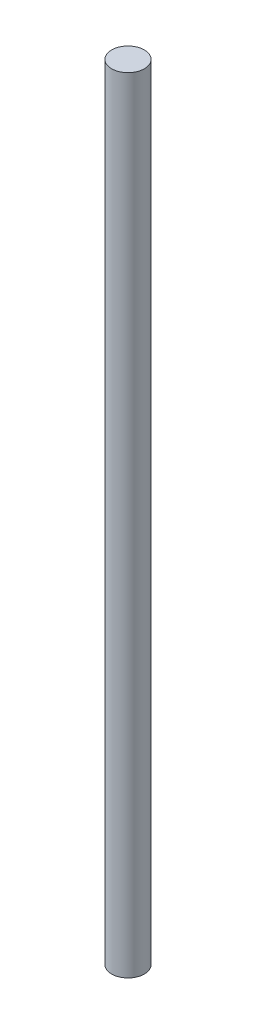
ISO-10303-21;
HEADER;
FILE_DESCRIPTION(('STEP AP214'),'2;1');
FILE_NAME('part.step','',(''),(''),'','','');
FILE_SCHEMA(('AUTOMOTIVE_DESIGN { 1 0 10303 214 1 1 1 1 }'));
ENDSEC;
DATA;
#1=APPLICATION_CONTEXT('core data for automotive mechanical design processes');
#2=APPLICATION_PROTOCOL_DEFINITION('international standard','automotive_design',2000,#1);
#3=PRODUCT_CONTEXT('',#1,'mechanical');
#4=PRODUCT('Part','Part','',(#3));
#5=PRODUCT_RELATED_PRODUCT_CATEGORY('part','',(#4));
#6=PRODUCT_DEFINITION_FORMATION('','',#4);
#7=PRODUCT_DEFINITION_CONTEXT('part definition',#1,'design');
#8=PRODUCT_DEFINITION('design','',#6,#7);
#9=PRODUCT_DEFINITION_SHAPE('','',#8);
#10=(LENGTH_UNIT() NAMED_UNIT(*) SI_UNIT(.MILLI.,.METRE.));
#11=(NAMED_UNIT(*) PLANE_ANGLE_UNIT() SI_UNIT($,.RADIAN.));
#12=(NAMED_UNIT(*) SI_UNIT($,.STERADIAN.) SOLID_ANGLE_UNIT());
#13=UNCERTAINTY_MEASURE_WITH_UNIT(LENGTH_MEASURE(1.E-05),#10,'distance_accuracy_value','');
#14=(GEOMETRIC_REPRESENTATION_CONTEXT(3) GLOBAL_UNCERTAINTY_ASSIGNED_CONTEXT((#13)) GLOBAL_UNIT_ASSIGNED_CONTEXT((#10,
#11,#12)) REPRESENTATION_CONTEXT('',''));
#15=CARTESIAN_POINT('',(0.,0.,0.));
#16=DIRECTION('',(0.,0.,1.));
#17=DIRECTION('',(1.,0.,0.));
#18=AXIS2_PLACEMENT_3D('',#15,#16,#17);
#19=CARTESIAN_POINT('',(0.,1219.2,0.));
#20=DIRECTION('',(0.,-1.,0.));
#21=DIRECTION('',(0.,0.,-1.));
#22=AXIS2_PLACEMENT_3D('',#19,#20,#21);
#23=CYLINDRICAL_SURFACE('',#22,25.4);
#24=CARTESIAN_POINT('',(0.,1219.2,0.));
#25=DIRECTION('',(0.,1.,0.));
#26=DIRECTION('',(0.,0.,1.));
#27=AXIS2_PLACEMENT_3D('',#24,#25,#26);
#28=CIRCLE('',#27,25.4);
#29=CARTESIAN_POINT('',(0.,1219.2,-25.4));
#30=VERTEX_POINT('',#29);
#31=EDGE_CURVE('E10',#30,#30,#28,.T.);
#32=CARTESIAN_POINT('',(0.,0.,0.));
#33=DIRECTION('',(0.,1.,0.));
#34=DIRECTION('',(0.,0.,1.));
#35=AXIS2_PLACEMENT_3D('',#32,#33,#34);
#36=CIRCLE('',#35,25.4);
#37=CARTESIAN_POINT('',(0.,0.,-25.4));
#38=VERTEX_POINT('',#37);
#39=EDGE_CURVE('E33',#38,#38,#36,.T.);
#40=CARTESIAN_POINT('',(0.,1219.2,-25.4));
#41=CARTESIAN_POINT('',(0.,1206.5,-25.4));
#42=CARTESIAN_POINT('',(0.,1193.8,-25.4));
#43=CARTESIAN_POINT('',(0.,1168.4,-25.4));
#44=CARTESIAN_POINT('',(0.,1155.7,-25.4));
#45=CARTESIAN_POINT('',(0.,1130.3,-25.4));
#46=CARTESIAN_POINT('',(0.,1117.6,-25.4));
#47=CARTESIAN_POINT('',(0.,1092.2,-25.4));
#48=CARTESIAN_POINT('',(0.,1079.5,-25.4));
#49=CARTESIAN_POINT('',(0.,1054.1,-25.4));
#50=CARTESIAN_POINT('',(0.,1041.4,-25.4));
#51=CARTESIAN_POINT('',(0.,1016.,-25.4));
#52=CARTESIAN_POINT('',(0.,1003.3,-25.4));
#53=CARTESIAN_POINT('',(0.,977.9,-25.4));
#54=CARTESIAN_POINT('',(0.,965.2,-25.4));
#55=CARTESIAN_POINT('',(0.,939.8,-25.4));
#56=CARTESIAN_POINT('',(0.,927.1,-25.4));
#57=CARTESIAN_POINT('',(0.,901.7,-25.4));
#58=CARTESIAN_POINT('',(0.,889.,-25.4));
#59=CARTESIAN_POINT('',(0.,863.6,-25.4));
#60=CARTESIAN_POINT('',(0.,850.9,-25.4));
#61=CARTESIAN_POINT('',(0.,825.5,-25.4));
#62=CARTESIAN_POINT('',(0.,812.8,-25.4));
#63=CARTESIAN_POINT('',(0.,787.4,-25.4));
#64=CARTESIAN_POINT('',(0.,774.7,-25.4));
#65=CARTESIAN_POINT('',(0.,749.3,-25.4));
#66=CARTESIAN_POINT('',(0.,736.6,-25.4));
#67=CARTESIAN_POINT('',(0.,711.2,-25.4));
#68=CARTESIAN_POINT('',(0.,698.5,-25.4));
#69=CARTESIAN_POINT('',(0.,673.1,-25.4));
#70=CARTESIAN_POINT('',(0.,660.4,-25.4));
#71=CARTESIAN_POINT('',(0.,635.,-25.4));
#72=CARTESIAN_POINT('',(0.,622.3,-25.4));
#73=CARTESIAN_POINT('',(0.,596.9,-25.4));
#74=CARTESIAN_POINT('',(0.,584.2,-25.4));
#75=CARTESIAN_POINT('',(0.,558.8,-25.4));
#76=CARTESIAN_POINT('',(0.,546.1,-25.4));
#77=CARTESIAN_POINT('',(0.,520.7,-25.4));
#78=CARTESIAN_POINT('',(0.,508.,-25.4));
#79=CARTESIAN_POINT('',(0.,482.6,-25.4));
#80=CARTESIAN_POINT('',(0.,469.9,-25.4));
#81=CARTESIAN_POINT('',(0.,444.5,-25.4));
#82=CARTESIAN_POINT('',(0.,431.8,-25.4));
#83=CARTESIAN_POINT('',(0.,406.4,-25.4));
#84=CARTESIAN_POINT('',(0.,393.7,-25.4));
#85=CARTESIAN_POINT('',(0.,368.3,-25.4));
#86=CARTESIAN_POINT('',(0.,355.6,-25.4));
#87=CARTESIAN_POINT('',(0.,330.2,-25.4));
#88=CARTESIAN_POINT('',(0.,317.5,-25.4));
#89=CARTESIAN_POINT('',(0.,292.1,-25.4));
#90=CARTESIAN_POINT('',(0.,279.4,-25.4));
#91=CARTESIAN_POINT('',(0.,254.,-25.4));
#92=CARTESIAN_POINT('',(0.,241.3,-25.4));
#93=CARTESIAN_POINT('',(0.,215.9,-25.4));
#94=CARTESIAN_POINT('',(0.,203.2,-25.4));
#95=CARTESIAN_POINT('',(0.,177.8,-25.4));
#96=CARTESIAN_POINT('',(0.,165.1,-25.4));
#97=CARTESIAN_POINT('',(0.,139.7,-25.4));
#98=CARTESIAN_POINT('',(0.,127.,-25.4));
#99=CARTESIAN_POINT('',(0.,101.6,-25.4));
#100=CARTESIAN_POINT('',(0.,88.9,-25.4));
#101=CARTESIAN_POINT('',(0.,63.5,-25.4));
#102=CARTESIAN_POINT('',(0.,50.8,-25.4));
#103=CARTESIAN_POINT('',(0.,25.4,-25.4));
#104=CARTESIAN_POINT('',(0.,12.7,-25.4));
#105=CARTESIAN_POINT('',(0.,0.,-25.4));
#106=B_SPLINE_CURVE_WITH_KNOTS('',3,(#40,#41,#42,#43,#44,#45,#46,#47,#48,#49,#50,#51,#52,#53,
#54,#55,#56,#57,#58,#59,#60,#61,#62,#63,#64,#65,#66,#67,#68,#69,#70,#71,#72,#73,#74,#75,#76,#77,
#78,#79,#80,#81,#82,#83,#84,#85,#86,#87,#88,#89,#90,#91,#92,#93,#94,#95,#96,#97,#98,#99,#100,
#101,#102,#103,#104,#105),.UNSPECIFIED.,.F.,.F.,(4,2,2,2,2,2,2,2,2,2,2,2,2,2,2,2,2,2,2,2,2,2,2,
2,2,2,2,2,2,2,2,2,4),(0.,38.1,76.2,114.3,152.4,190.5,228.6,266.7,304.8,342.9,381.,419.1,457.2,
495.3,533.4,571.5,609.6,647.7,685.8,723.9,762.,800.1,838.2,876.3,914.4,952.5,990.6,1028.7,
1066.8,1104.9,1143.,1181.1,1219.2),.UNSPECIFIED.);
#107=EDGE_CURVE('BSEAM30',#30,#38,#106,.T.);
#108=ORIENTED_EDGE('',*,*,#31,.F.);
#109=ORIENTED_EDGE('',*,*,#39,.T.);
#110=ORIENTED_EDGE('',*,*,#107,.T.);
#111=ORIENTED_EDGE('',*,*,#107,.F.);
#112=EDGE_LOOP('',(#108,#110,#109,#111));
#113=FACE_BOUND('',#112,.T.);
#114=ADVANCED_FACE('F30',(#113),#23,.T.);
#115=CARTESIAN_POINT('',(0.,1219.2,0.));
#116=DIRECTION('',(0.,1.,0.));
#117=DIRECTION('',(0.,0.,1.));
#118=AXIS2_PLACEMENT_3D('',#115,#116,#117);
#119=PLANE('',#118);
#120=ORIENTED_EDGE('',*,*,#31,.T.);
#121=EDGE_LOOP('',(#120));
#122=FACE_BOUND('',#121,.T.);
#123=ADVANCED_FACE('F45',(#122),#119,.T.);
#124=CARTESIAN_POINT('',(0.,0.,0.));
#125=DIRECTION('',(0.,1.,0.));
#126=DIRECTION('',(0.,0.,1.));
#127=AXIS2_PLACEMENT_3D('',#124,#125,#126);
#128=PLANE('',#127);
#129=ORIENTED_EDGE('',*,*,#39,.F.);
#130=EDGE_LOOP('',(#129));
#131=FACE_BOUND('',#130,.T.);
#132=ADVANCED_FACE('F43',(#131),#128,.F.);
#133=CLOSED_SHELL('',(#114,#123,#132));
#134=MANIFOLD_SOLID_BREP('B2',#133);
#135=ADVANCED_BREP_SHAPE_REPRESENTATION('',(#18,#134),#14);
#136=SHAPE_DEFINITION_REPRESENTATION(#9,#135);
ENDSEC;
END-ISO-10303-21;
